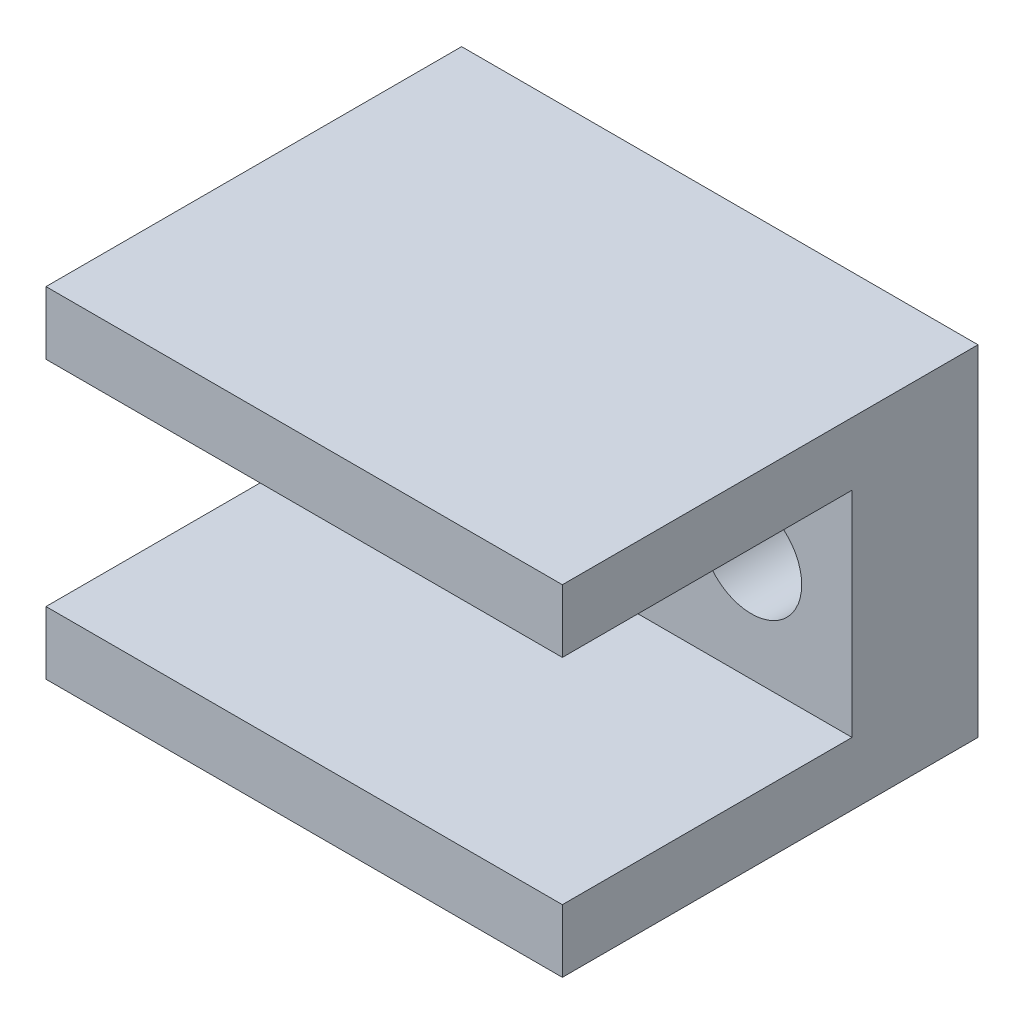
ISO-10303-21;
HEADER;
FILE_DESCRIPTION(('STEP AP214'),'2;1');
FILE_NAME('part.step','',(''),(''),'','','');
FILE_SCHEMA(('AUTOMOTIVE_DESIGN { 1 0 10303 214 1 1 1 1 }'));
ENDSEC;
DATA;
#1=APPLICATION_CONTEXT('core data for automotive mechanical design processes');
#2=APPLICATION_PROTOCOL_DEFINITION('international standard','automotive_design',2000,#1);
#3=PRODUCT_CONTEXT('',#1,'mechanical');
#4=PRODUCT('Part','Part','',(#3));
#5=PRODUCT_RELATED_PRODUCT_CATEGORY('part','',(#4));
#6=PRODUCT_DEFINITION_FORMATION('','',#4);
#7=PRODUCT_DEFINITION_CONTEXT('part definition',#1,'design');
#8=PRODUCT_DEFINITION('design','',#6,#7);
#9=PRODUCT_DEFINITION_SHAPE('','',#8);
#10=(LENGTH_UNIT() NAMED_UNIT(*) SI_UNIT(.MILLI.,.METRE.));
#11=(NAMED_UNIT(*) PLANE_ANGLE_UNIT() SI_UNIT($,.RADIAN.));
#12=(NAMED_UNIT(*) SI_UNIT($,.STERADIAN.) SOLID_ANGLE_UNIT());
#13=UNCERTAINTY_MEASURE_WITH_UNIT(LENGTH_MEASURE(1.E-05),#10,'distance_accuracy_value','');
#14=(GEOMETRIC_REPRESENTATION_CONTEXT(3) GLOBAL_UNCERTAINTY_ASSIGNED_CONTEXT((#13)) GLOBAL_UNIT_ASSIGNED_CONTEXT((#10,
#11,#12)) REPRESENTATION_CONTEXT('',''));
#15=CARTESIAN_POINT('',(0.,0.,0.));
#16=DIRECTION('',(0.,0.,1.));
#17=DIRECTION('',(1.,0.,0.));
#18=AXIS2_PLACEMENT_3D('',#15,#16,#17);
#19=CARTESIAN_POINT('',(0.,0.,10.));
#20=DIRECTION('',(0.,0.,-1.));
#21=DIRECTION('',(-1.,0.,0.));
#22=AXIS2_PLACEMENT_3D('',#19,#20,#21);
#23=PLANE('',#22);
#24=CARTESIAN_POINT('',(-12.5,0.,10.));
#25=DIRECTION('',(0.,0.,1.));
#26=DIRECTION('',(1.,0.,0.));
#27=AXIS2_PLACEMENT_3D('',#24,#25,#26);
#28=CIRCLE('',#27,4.);
#29=CARTESIAN_POINT('',(-8.5,0.,10.));
#30=VERTEX_POINT('',#29);
#31=EDGE_CURVE('E129',#30,#30,#28,.T.);
#32=ORIENTED_EDGE('',*,*,#31,.F.);
#33=EDGE_LOOP('',(#32));
#34=FACE_BOUND('',#33,.T.);
#35=CARTESIAN_POINT('',(12.5,0.,10.));
#36=DIRECTION('',(0.,0.,1.));
#37=DIRECTION('',(1.,0.,0.));
#38=AXIS2_PLACEMENT_3D('',#35,#36,#37);
#39=CIRCLE('',#38,4.);
#40=CARTESIAN_POINT('',(16.5,0.,10.));
#41=VERTEX_POINT('',#40);
#42=EDGE_CURVE('E342',#41,#41,#39,.T.);
#43=ORIENTED_EDGE('',*,*,#42,.F.);
#44=EDGE_LOOP('',(#43));
#45=FACE_BOUND('',#44,.T.);
#46=DIRECTION('',(-1.,0.,0.));
#47=VECTOR('',#46,1.);
#48=CARTESIAN_POINT('',(-20.5,-8.5,10.));
#49=LINE('',#48,#47);
#50=CARTESIAN_POINT('',(20.5,-8.5,10.));
#51=VERTEX_POINT('',#50);
#52=CARTESIAN_POINT('',(-20.5,-8.5,10.));
#53=VERTEX_POINT('',#52);
#54=EDGE_CURVE('E126',#51,#53,#49,.T.);
#55=ORIENTED_EDGE('',*,*,#54,.F.);
#56=DIRECTION('',(0.,1.,0.));
#57=VECTOR('',#56,1.);
#58=CARTESIAN_POINT('',(20.5,-13.5,10.));
#59=LINE('',#58,#57);
#60=CARTESIAN_POINT('',(20.5,8.5,10.));
#61=VERTEX_POINT('',#60);
#62=EDGE_CURVE('E174',#51,#61,#59,.T.);
#63=ORIENTED_EDGE('',*,*,#62,.T.);
#64=DIRECTION('',(1.,0.,0.));
#65=VECTOR('',#64,1.);
#66=CARTESIAN_POINT('',(-20.5,8.5,10.));
#67=LINE('',#66,#65);
#68=CARTESIAN_POINT('',(-20.5,8.5,10.));
#69=VERTEX_POINT('',#68);
#70=EDGE_CURVE('E146',#69,#61,#67,.T.);
#71=ORIENTED_EDGE('',*,*,#70,.F.);
#72=DIRECTION('',(0.,1.,0.));
#73=VECTOR('',#72,1.);
#74=CARTESIAN_POINT('',(-20.5,-13.5,10.));
#75=LINE('',#74,#73);
#76=EDGE_CURVE('E57',#53,#69,#75,.T.);
#77=ORIENTED_EDGE('',*,*,#76,.F.);
#78=EDGE_LOOP('',(#55,#63,#71,#77));
#79=FACE_BOUND('',#78,.T.);
#80=ADVANCED_FACE('F39',(#34,#45,#79),#23,.F.);
#81=CARTESIAN_POINT('',(-20.5,-13.5,10.));
#82=DIRECTION('',(-1.,0.,0.));
#83=DIRECTION('',(0.,0.,1.));
#84=AXIS2_PLACEMENT_3D('',#81,#82,#83);
#85=PLANE('',#84);
#86=DIRECTION('',(0.,1.,0.));
#87=VECTOR('',#86,1.);
#88=CARTESIAN_POINT('',(-20.5,-13.5,0.));
#89=LINE('',#88,#87);
#90=CARTESIAN_POINT('',(-20.5,-13.5,0.));
#91=VERTEX_POINT('',#90);
#92=CARTESIAN_POINT('',(-20.5,13.5,0.));
#93=VERTEX_POINT('',#92);
#94=EDGE_CURVE('E109',#91,#93,#89,.T.);
#95=ORIENTED_EDGE('',*,*,#94,.F.);
#96=DIRECTION('',(0.,0.,-1.));
#97=VECTOR('',#96,1.);
#98=CARTESIAN_POINT('',(-20.5,-13.5,10.));
#99=LINE('',#98,#97);
#100=CARTESIAN_POINT('',(-20.5,-13.5,33.));
#101=VERTEX_POINT('',#100);
#102=EDGE_CURVE('E11',#101,#91,#99,.T.);
#103=ORIENTED_EDGE('',*,*,#102,.F.);
#104=DIRECTION('',(0.,-1.,0.));
#105=VECTOR('',#104,1.);
#106=CARTESIAN_POINT('',(-20.5,-8.5,33.));
#107=LINE('',#106,#105);
#108=CARTESIAN_POINT('',(-20.5,-8.5,33.));
#109=VERTEX_POINT('',#108);
#110=EDGE_CURVE('E107',#109,#101,#107,.T.);
#111=ORIENTED_EDGE('',*,*,#110,.F.);
#112=DIRECTION('',(0.,0.,-1.));
#113=VECTOR('',#112,1.);
#114=CARTESIAN_POINT('',(-20.5,-8.5,33.));
#115=LINE('',#114,#113);
#116=EDGE_CURVE('E138',#109,#53,#115,.T.);
#117=ORIENTED_EDGE('',*,*,#116,.T.);
#118=ORIENTED_EDGE('',*,*,#76,.T.);
#119=DIRECTION('',(0.,0.,-1.));
#120=VECTOR('',#119,1.);
#121=CARTESIAN_POINT('',(-20.5,8.5,33.));
#122=LINE('',#121,#120);
#123=CARTESIAN_POINT('',(-20.5,8.5,33.));
#124=VERTEX_POINT('',#123);
#125=EDGE_CURVE('E168',#124,#69,#122,.T.);
#126=ORIENTED_EDGE('',*,*,#125,.F.);
#127=DIRECTION('',(0.,-1.,0.));
#128=VECTOR('',#127,1.);
#129=CARTESIAN_POINT('',(-20.5,8.5,33.));
#130=LINE('',#129,#128);
#131=CARTESIAN_POINT('',(-20.5,13.5,33.));
#132=VERTEX_POINT('',#131);
#133=EDGE_CURVE('E155',#132,#124,#130,.T.);
#134=ORIENTED_EDGE('',*,*,#133,.F.);
#135=DIRECTION('',(0.,0.,-1.));
#136=VECTOR('',#135,1.);
#137=CARTESIAN_POINT('',(-20.5,13.5,10.));
#138=LINE('',#137,#136);
#139=EDGE_CURVE('E43',#132,#93,#138,.T.);
#140=ORIENTED_EDGE('',*,*,#139,.T.);
#141=EDGE_LOOP('',(#95,#103,#111,#117,#118,#126,#134,#140));
#142=FACE_BOUND('',#141,.T.);
#143=ADVANCED_FACE('F41',(#142),#85,.T.);
#144=CARTESIAN_POINT('',(-20.5,-13.5,10.));
#145=DIRECTION('',(0.,1.,0.));
#146=DIRECTION('',(0.,0.,1.));
#147=AXIS2_PLACEMENT_3D('',#144,#145,#146);
#148=PLANE('',#147);
#149=DIRECTION('',(1.,0.,0.));
#150=VECTOR('',#149,1.);
#151=CARTESIAN_POINT('',(-20.5,-13.5,0.));
#152=LINE('',#151,#150);
#153=CARTESIAN_POINT('',(20.5,-13.5,0.));
#154=VERTEX_POINT('',#153);
#155=EDGE_CURVE('E175',#91,#154,#152,.T.);
#156=ORIENTED_EDGE('',*,*,#155,.T.);
#157=DIRECTION('',(0.,0.,-1.));
#158=VECTOR('',#157,1.);
#159=CARTESIAN_POINT('',(20.5,-13.5,10.));
#160=LINE('',#159,#158);
#161=CARTESIAN_POINT('',(20.5,-13.5,33.));
#162=VERTEX_POINT('',#161);
#163=EDGE_CURVE('E49',#162,#154,#160,.T.);
#164=ORIENTED_EDGE('',*,*,#163,.F.);
#165=DIRECTION('',(1.,0.,0.));
#166=VECTOR('',#165,1.);
#167=CARTESIAN_POINT('',(-20.5,-13.5,33.));
#168=LINE('',#167,#166);
#169=EDGE_CURVE('E113',#101,#162,#168,.T.);
#170=ORIENTED_EDGE('',*,*,#169,.F.);
#171=ORIENTED_EDGE('',*,*,#102,.T.);
#172=EDGE_LOOP('',(#156,#164,#170,#171));
#173=FACE_BOUND('',#172,.T.);
#174=ADVANCED_FACE('F114',(#173),#148,.F.);
#175=CARTESIAN_POINT('',(20.5,-13.5,10.));
#176=DIRECTION('',(-1.,0.,0.));
#177=DIRECTION('',(0.,0.,1.));
#178=AXIS2_PLACEMENT_3D('',#175,#176,#177);
#179=PLANE('',#178);
#180=DIRECTION('',(0.,1.,0.));
#181=VECTOR('',#180,1.);
#182=CARTESIAN_POINT('',(20.5,-13.5,0.));
#183=LINE('',#182,#181);
#184=CARTESIAN_POINT('',(20.5,13.5,0.));
#185=VERTEX_POINT('',#184);
#186=EDGE_CURVE('E184',#154,#185,#183,.T.);
#187=ORIENTED_EDGE('',*,*,#186,.T.);
#188=DIRECTION('',(0.,0.,-1.));
#189=VECTOR('',#188,1.);
#190=CARTESIAN_POINT('',(20.5,13.5,10.));
#191=LINE('',#190,#189);
#192=CARTESIAN_POINT('',(20.5,13.5,33.));
#193=VERTEX_POINT('',#192);
#194=EDGE_CURVE('E191',#193,#185,#191,.T.);
#195=ORIENTED_EDGE('',*,*,#194,.F.);
#196=DIRECTION('',(0.,1.,0.));
#197=VECTOR('',#196,1.);
#198=CARTESIAN_POINT('',(20.5,8.5,33.));
#199=LINE('',#198,#197);
#200=CARTESIAN_POINT('',(20.5,8.5,33.));
#201=VERTEX_POINT('',#200);
#202=EDGE_CURVE('E147',#201,#193,#199,.T.);
#203=ORIENTED_EDGE('',*,*,#202,.F.);
#204=DIRECTION('',(0.,0.,-1.));
#205=VECTOR('',#204,1.);
#206=CARTESIAN_POINT('',(20.5,8.5,33.));
#207=LINE('',#206,#205);
#208=EDGE_CURVE('E161',#201,#61,#207,.T.);
#209=ORIENTED_EDGE('',*,*,#208,.T.);
#210=ORIENTED_EDGE('',*,*,#62,.F.);
#211=DIRECTION('',(0.,0.,-1.));
#212=VECTOR('',#211,1.);
#213=CARTESIAN_POINT('',(20.5,-8.5,33.));
#214=LINE('',#213,#212);
#215=CARTESIAN_POINT('',(20.5,-8.5,33.));
#216=VERTEX_POINT('',#215);
#217=EDGE_CURVE('E142',#216,#51,#214,.T.);
#218=ORIENTED_EDGE('',*,*,#217,.F.);
#219=DIRECTION('',(0.,1.,0.));
#220=VECTOR('',#219,1.);
#221=CARTESIAN_POINT('',(20.5,-8.5,33.));
#222=LINE('',#221,#220);
#223=EDGE_CURVE('E119',#162,#216,#222,.T.);
#224=ORIENTED_EDGE('',*,*,#223,.F.);
#225=ORIENTED_EDGE('',*,*,#163,.T.);
#226=EDGE_LOOP('',(#187,#195,#203,#209,#210,#218,#224,#225));
#227=FACE_BOUND('',#226,.T.);
#228=ADVANCED_FACE('F203',(#227),#179,.F.);
#229=CARTESIAN_POINT('',(-20.5,13.5,10.));
#230=DIRECTION('',(0.,1.,0.));
#231=DIRECTION('',(0.,0.,1.));
#232=AXIS2_PLACEMENT_3D('',#229,#230,#231);
#233=PLANE('',#232);
#234=DIRECTION('',(1.,0.,0.));
#235=VECTOR('',#234,1.);
#236=CARTESIAN_POINT('',(-20.5,13.5,0.));
#237=LINE('',#236,#235);
#238=EDGE_CURVE('E180',#93,#185,#237,.T.);
#239=ORIENTED_EDGE('',*,*,#238,.F.);
#240=ORIENTED_EDGE('',*,*,#139,.F.);
#241=DIRECTION('',(-1.,0.,0.));
#242=VECTOR('',#241,1.);
#243=CARTESIAN_POINT('',(-20.5,13.5,33.));
#244=LINE('',#243,#242);
#245=EDGE_CURVE('E151',#193,#132,#244,.T.);
#246=ORIENTED_EDGE('',*,*,#245,.F.);
#247=ORIENTED_EDGE('',*,*,#194,.T.);
#248=EDGE_LOOP('',(#239,#240,#246,#247));
#249=FACE_BOUND('',#248,.T.);
#250=ADVANCED_FACE('F198',(#249),#233,.T.);
#251=CARTESIAN_POINT('',(0.,0.,0.));
#252=DIRECTION('',(0.,0.,-1.));
#253=DIRECTION('',(-1.,0.,0.));
#254=AXIS2_PLACEMENT_3D('',#251,#252,#253);
#255=PLANE('',#254);
#256=CARTESIAN_POINT('',(-12.5,0.,0.));
#257=DIRECTION('',(0.,0.,-1.));
#258=DIRECTION('',(-1.,0.,0.));
#259=AXIS2_PLACEMENT_3D('',#256,#257,#258);
#260=CIRCLE('',#259,4.);
#261=CARTESIAN_POINT('',(-16.5,0.,0.));
#262=VERTEX_POINT('',#261);
#263=EDGE_CURVE('E337',#262,#262,#260,.F.);
#264=ORIENTED_EDGE('',*,*,#263,.T.);
#265=EDGE_LOOP('',(#264));
#266=FACE_BOUND('',#265,.T.);
#267=CARTESIAN_POINT('',(12.5,0.,0.));
#268=DIRECTION('',(0.,0.,-1.));
#269=DIRECTION('',(-1.,0.,0.));
#270=AXIS2_PLACEMENT_3D('',#267,#268,#269);
#271=CIRCLE('',#270,4.);
#272=CARTESIAN_POINT('',(8.5,0.,0.));
#273=VERTEX_POINT('',#272);
#274=EDGE_CURVE('E132',#273,#273,#271,.F.);
#275=ORIENTED_EDGE('',*,*,#274,.T.);
#276=EDGE_LOOP('',(#275));
#277=FACE_BOUND('',#276,.T.);
#278=ORIENTED_EDGE('',*,*,#94,.T.);
#279=ORIENTED_EDGE('',*,*,#238,.T.);
#280=ORIENTED_EDGE('',*,*,#186,.F.);
#281=ORIENTED_EDGE('',*,*,#155,.F.);
#282=EDGE_LOOP('',(#278,#279,#280,#281));
#283=FACE_BOUND('',#282,.T.);
#284=ADVANCED_FACE('F201',(#266,#277,#283),#255,.T.);
#285=CARTESIAN_POINT('',(-20.5,8.5,33.));
#286=DIRECTION('',(0.,1.,0.));
#287=DIRECTION('',(0.,0.,1.));
#288=AXIS2_PLACEMENT_3D('',#285,#286,#287);
#289=PLANE('',#288);
#290=ORIENTED_EDGE('',*,*,#70,.T.);
#291=ORIENTED_EDGE('',*,*,#208,.F.);
#292=DIRECTION('',(1.,0.,0.));
#293=VECTOR('',#292,1.);
#294=CARTESIAN_POINT('',(-20.5,8.5,33.));
#295=LINE('',#294,#293);
#296=EDGE_CURVE('E158',#124,#201,#295,.T.);
#297=ORIENTED_EDGE('',*,*,#296,.F.);
#298=ORIENTED_EDGE('',*,*,#125,.T.);
#299=EDGE_LOOP('',(#290,#291,#297,#298));
#300=FACE_BOUND('',#299,.T.);
#301=ADVANCED_FACE('F209',(#300),#289,.F.);
#302=CARTESIAN_POINT('',(0.,0.,33.));
#303=DIRECTION('',(0.,0.,-1.));
#304=DIRECTION('',(-1.,0.,0.));
#305=AXIS2_PLACEMENT_3D('',#302,#303,#304);
#306=PLANE('',#305);
#307=ORIENTED_EDGE('',*,*,#202,.T.);
#308=ORIENTED_EDGE('',*,*,#245,.T.);
#309=ORIENTED_EDGE('',*,*,#133,.T.);
#310=ORIENTED_EDGE('',*,*,#296,.T.);
#311=EDGE_LOOP('',(#307,#308,#309,#310));
#312=FACE_BOUND('',#311,.T.);
#313=ADVANCED_FACE('F213',(#312),#306,.F.);
#314=CARTESIAN_POINT('',(-20.5,-8.5,33.));
#315=DIRECTION('',(0.,-1.,0.));
#316=DIRECTION('',(0.,0.,-1.));
#317=AXIS2_PLACEMENT_3D('',#314,#315,#316);
#318=PLANE('',#317);
#319=ORIENTED_EDGE('',*,*,#54,.T.);
#320=ORIENTED_EDGE('',*,*,#116,.F.);
#321=DIRECTION('',(-1.,0.,0.));
#322=VECTOR('',#321,1.);
#323=CARTESIAN_POINT('',(-20.5,-8.5,33.));
#324=LINE('',#323,#322);
#325=EDGE_CURVE('E123',#216,#109,#324,.T.);
#326=ORIENTED_EDGE('',*,*,#325,.F.);
#327=ORIENTED_EDGE('',*,*,#217,.T.);
#328=EDGE_LOOP('',(#319,#320,#326,#327));
#329=FACE_BOUND('',#328,.T.);
#330=ADVANCED_FACE('F206',(#329),#318,.F.);
#331=CARTESIAN_POINT('',(0.,0.,33.));
#332=DIRECTION('',(0.,0.,1.));
#333=DIRECTION('',(1.,0.,0.));
#334=AXIS2_PLACEMENT_3D('',#331,#332,#333);
#335=PLANE('',#334);
#336=ORIENTED_EDGE('',*,*,#110,.T.);
#337=ORIENTED_EDGE('',*,*,#169,.T.);
#338=ORIENTED_EDGE('',*,*,#223,.T.);
#339=ORIENTED_EDGE('',*,*,#325,.T.);
#340=EDGE_LOOP('',(#336,#337,#338,#339));
#341=FACE_BOUND('',#340,.T.);
#342=ADVANCED_FACE('F121',(#341),#335,.T.);
#343=CARTESIAN_POINT('',(12.5,0.,-0.000999999999999265));
#344=DIRECTION('',(0.,0.,1.));
#345=DIRECTION('',(1.,0.,0.));
#346=AXIS2_PLACEMENT_3D('',#343,#344,#345);
#347=CYLINDRICAL_SURFACE('',#346,4.);
#348=ORIENTED_EDGE('',*,*,#274,.F.);
#349=EDGE_LOOP('',(#348));
#350=FACE_BOUND('',#349,.T.);
#351=ORIENTED_EDGE('',*,*,#42,.T.);
#352=EDGE_LOOP('',(#351));
#353=FACE_BOUND('',#352,.T.);
#354=ADVANCED_FACE('F269',(#350,#353),#347,.F.);
#355=CARTESIAN_POINT('',(-12.5,0.,-0.000999999999999265));
#356=DIRECTION('',(0.,0.,1.));
#357=DIRECTION('',(1.,0.,0.));
#358=AXIS2_PLACEMENT_3D('',#355,#356,#357);
#359=CYLINDRICAL_SURFACE('',#358,4.);
#360=ORIENTED_EDGE('',*,*,#263,.F.);
#361=EDGE_LOOP('',(#360));
#362=FACE_BOUND('',#361,.T.);
#363=ORIENTED_EDGE('',*,*,#31,.T.);
#364=EDGE_LOOP('',(#363));
#365=FACE_BOUND('',#364,.T.);
#366=ADVANCED_FACE('F320',(#362,#365),#359,.F.);
#367=CLOSED_SHELL('',(#80,#143,#174,#228,#250,#284,#301,#313,#330,#342,#354,#366));
#368=MANIFOLD_SOLID_BREP('B2',#367);
#369=ADVANCED_BREP_SHAPE_REPRESENTATION('',(#18,#368),#14);
#370=SHAPE_DEFINITION_REPRESENTATION(#9,#369);
ENDSEC;
END-ISO-10303-21;
